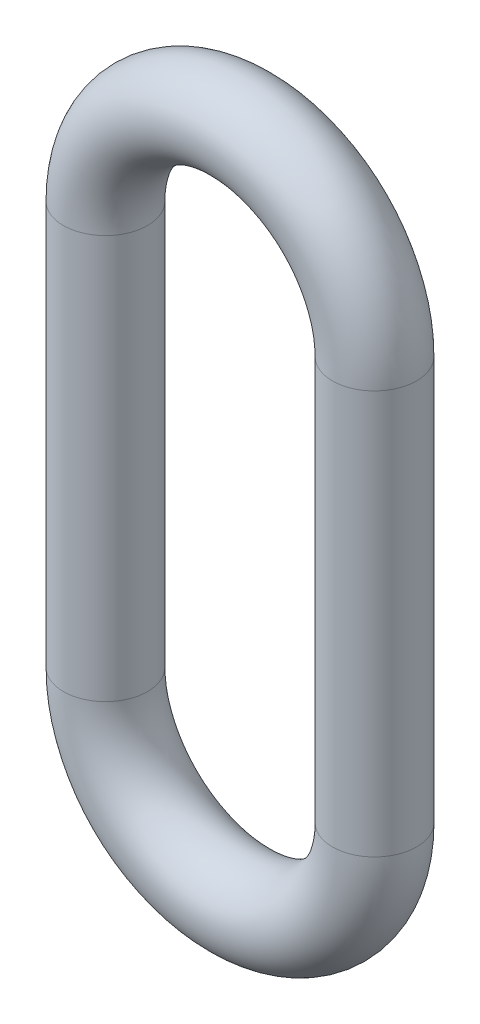
ISO-10303-21;
HEADER;
FILE_DESCRIPTION(('STEP AP214'),'2;1');
FILE_NAME('part.step','',(''),(''),'','','');
FILE_SCHEMA(('AUTOMOTIVE_DESIGN { 1 0 10303 214 1 1 1 1 }'));
ENDSEC;
DATA;
#1=APPLICATION_CONTEXT('core data for automotive mechanical design processes');
#2=APPLICATION_PROTOCOL_DEFINITION('international standard','automotive_design',2000,#1);
#3=PRODUCT_CONTEXT('',#1,'mechanical');
#4=PRODUCT('Part','Part','',(#3));
#5=PRODUCT_RELATED_PRODUCT_CATEGORY('part','',(#4));
#6=PRODUCT_DEFINITION_FORMATION('','',#4);
#7=PRODUCT_DEFINITION_CONTEXT('part definition',#1,'design');
#8=PRODUCT_DEFINITION('design','',#6,#7);
#9=PRODUCT_DEFINITION_SHAPE('','',#8);
#10=(LENGTH_UNIT() NAMED_UNIT(*) SI_UNIT(.MILLI.,.METRE.));
#11=(NAMED_UNIT(*) PLANE_ANGLE_UNIT() SI_UNIT($,.RADIAN.));
#12=(NAMED_UNIT(*) SI_UNIT($,.STERADIAN.) SOLID_ANGLE_UNIT());
#13=UNCERTAINTY_MEASURE_WITH_UNIT(LENGTH_MEASURE(1.E-05),#10,'distance_accuracy_value','');
#14=(GEOMETRIC_REPRESENTATION_CONTEXT(3) GLOBAL_UNCERTAINTY_ASSIGNED_CONTEXT((#13)) GLOBAL_UNIT_ASSIGNED_CONTEXT((#10,
#11,#12)) REPRESENTATION_CONTEXT('',''));
#15=CARTESIAN_POINT('',(0.,0.,0.));
#16=DIRECTION('',(0.,0.,1.));
#17=DIRECTION('',(1.,0.,0.));
#18=AXIS2_PLACEMENT_3D('',#15,#16,#17);
#19=CARTESIAN_POINT('',(0.,0.,0.));
#20=DIRECTION('',(0.,0.,1.));
#21=DIRECTION('',(1.,0.,0.));
#22=AXIS2_PLACEMENT_3D('',#19,#20,#21);
#23=TOROIDAL_SURFACE('',#22,8.,2.5);
#24=CARTESIAN_POINT('',(-8.,0.,0.));
#25=DIRECTION('',(0.,1.,0.));
#26=DIRECTION('',(0.,0.,1.));
#27=AXIS2_PLACEMENT_3D('',#24,#25,#26);
#28=CIRCLE('',#27,2.5);
#29=CARTESIAN_POINT('',(-10.5,0.,0.));
#30=VERTEX_POINT('',#29);
#31=EDGE_CURVE('E47',#30,#30,#28,.T.);
#32=CARTESIAN_POINT('',(8.,0.,0.));
#33=DIRECTION('',(0.,-1.,0.));
#34=DIRECTION('',(0.,0.,1.));
#35=AXIS2_PLACEMENT_3D('',#32,#33,#34);
#36=CIRCLE('',#35,2.5);
#37=CARTESIAN_POINT('',(10.5,0.,0.));
#38=VERTEX_POINT('',#37);
#39=EDGE_CURVE('E43',#38,#38,#36,.T.);
#40=CARTESIAN_POINT('',(0.,0.,0.));
#41=DIRECTION('',(0.,0.,1.));
#42=DIRECTION('',(1.,0.,0.));
#43=AXIS2_PLACEMENT_3D('',#40,#41,#42);
#44=CIRCLE('',#43,10.5);
#45=EDGE_CURVE('',#30,#38,#44,.T.);
#46=ORIENTED_EDGE('',*,*,#31,.F.);
#47=ORIENTED_EDGE('',*,*,#39,.T.);
#48=ORIENTED_EDGE('',*,*,#45,.T.);
#49=ORIENTED_EDGE('',*,*,#45,.F.);
#50=EDGE_LOOP('',(#46,#48,#47,#49));
#51=FACE_BOUND('',#50,.T.);
#52=ADVANCED_FACE('F32',(#51),#23,.T.);
#53=CARTESIAN_POINT('',(8.,0.,0.));
#54=DIRECTION('',(0.,1.,0.));
#55=DIRECTION('',(0.,0.,1.));
#56=AXIS2_PLACEMENT_3D('',#53,#54,#55);
#57=CYLINDRICAL_SURFACE('',#56,2.5);
#58=CARTESIAN_POINT('',(8.,24.,0.));
#59=DIRECTION('',(0.,-1.,0.));
#60=DIRECTION('',(0.,0.,1.));
#61=AXIS2_PLACEMENT_3D('',#58,#59,#60);
#62=CIRCLE('',#61,2.5);
#63=CARTESIAN_POINT('',(10.5,24.,0.));
#64=VERTEX_POINT('',#63);
#65=EDGE_CURVE('E39',#64,#64,#62,.T.);
#66=ORIENTED_EDGE('',*,*,#65,.T.);
#67=EDGE_LOOP('',(#66));
#68=FACE_BOUND('',#67,.T.);
#69=ORIENTED_EDGE('',*,*,#39,.F.);
#70=EDGE_LOOP('',(#69));
#71=FACE_BOUND('',#70,.T.);
#72=ADVANCED_FACE('F56',(#68,#71),#57,.T.);
#73=CARTESIAN_POINT('',(0.,24.,0.));
#74=DIRECTION('',(0.,0.,1.));
#75=DIRECTION('',(1.,0.,0.));
#76=AXIS2_PLACEMENT_3D('',#73,#74,#75);
#77=TOROIDAL_SURFACE('',#76,8.,2.5);
#78=CARTESIAN_POINT('',(-8.,24.,0.));
#79=DIRECTION('',(0.,1.,0.));
#80=DIRECTION('',(0.,0.,1.));
#81=AXIS2_PLACEMENT_3D('',#78,#79,#80);
#82=CIRCLE('',#81,2.5);
#83=CARTESIAN_POINT('',(-10.5,24.,0.));
#84=VERTEX_POINT('',#83);
#85=EDGE_CURVE('E10',#84,#84,#82,.T.);
#86=CARTESIAN_POINT('',(0.,24.,0.));
#87=DIRECTION('',(0.,0.,1.));
#88=DIRECTION('',(1.,0.,0.));
#89=AXIS2_PLACEMENT_3D('',#86,#87,#88);
#90=CIRCLE('',#89,10.5);
#91=EDGE_CURVE('',#64,#84,#90,.T.);
#92=ORIENTED_EDGE('',*,*,#65,.F.);
#93=ORIENTED_EDGE('',*,*,#85,.T.);
#94=ORIENTED_EDGE('',*,*,#91,.T.);
#95=ORIENTED_EDGE('',*,*,#91,.F.);
#96=EDGE_LOOP('',(#92,#94,#93,#95));
#97=FACE_BOUND('',#96,.T.);
#98=ADVANCED_FACE('F62',(#97),#77,.T.);
#99=CARTESIAN_POINT('',(-8.,24.,0.));
#100=DIRECTION('',(0.,-1.,0.));
#101=DIRECTION('',(0.,0.,-1.));
#102=AXIS2_PLACEMENT_3D('',#99,#100,#101);
#103=CYLINDRICAL_SURFACE('',#102,2.5);
#104=ORIENTED_EDGE('',*,*,#31,.T.);
#105=EDGE_LOOP('',(#104));
#106=FACE_BOUND('',#105,.T.);
#107=ORIENTED_EDGE('',*,*,#85,.F.);
#108=EDGE_LOOP('',(#107));
#109=FACE_BOUND('',#108,.T.);
#110=ADVANCED_FACE('F34',(#106,#109),#103,.T.);
#111=CLOSED_SHELL('',(#52,#72,#98,#110));
#112=MANIFOLD_SOLID_BREP('B2',#111);
#113=ADVANCED_BREP_SHAPE_REPRESENTATION('',(#18,#112),#14);
#114=SHAPE_DEFINITION_REPRESENTATION(#9,#113);
ENDSEC;
END-ISO-10303-21;
